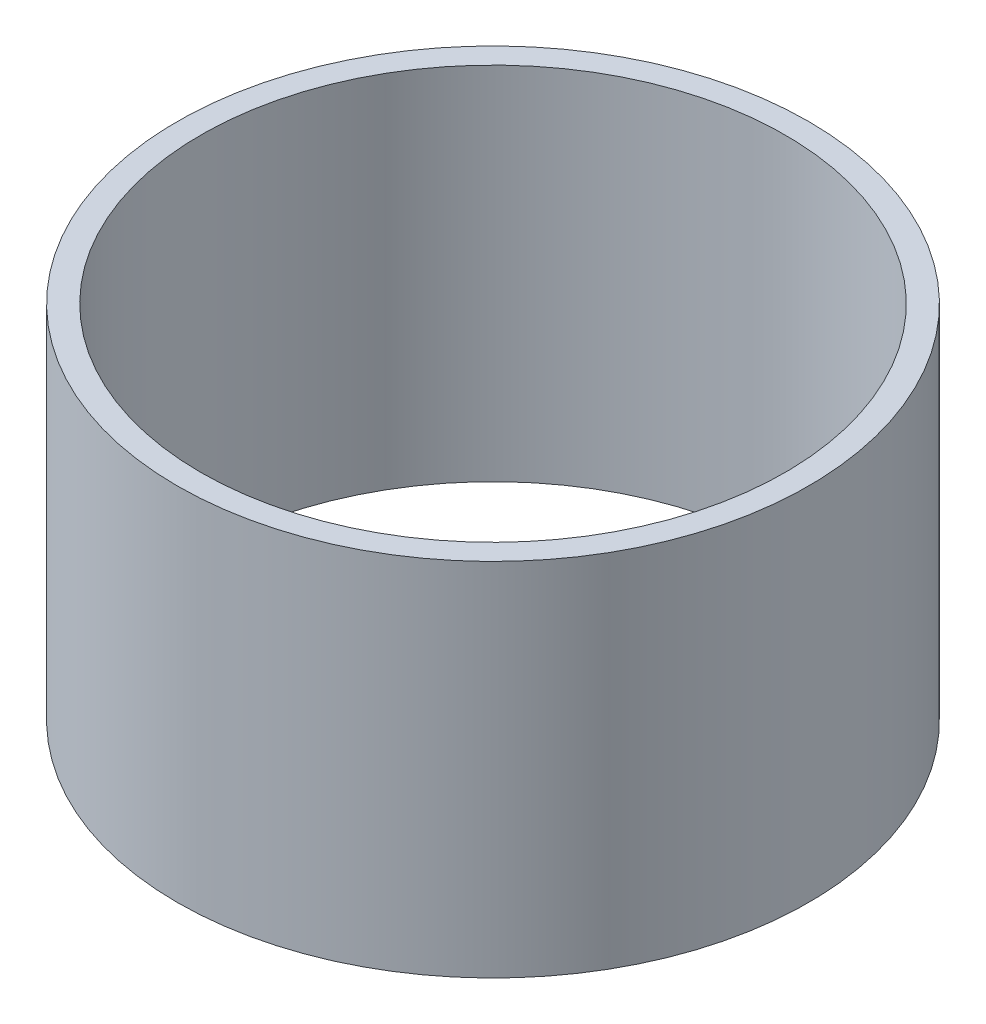
ISO-10303-21;
HEADER;
FILE_DESCRIPTION(('STEP AP214'),'2;1');
FILE_NAME('part.step','',(''),(''),'','','');
FILE_SCHEMA(('AUTOMOTIVE_DESIGN { 1 0 10303 214 1 1 1 1 }'));
ENDSEC;
DATA;
#1=APPLICATION_CONTEXT('core data for automotive mechanical design processes');
#2=APPLICATION_PROTOCOL_DEFINITION('international standard','automotive_design',2000,#1);
#3=PRODUCT_CONTEXT('',#1,'mechanical');
#4=PRODUCT('Part','Part','',(#3));
#5=PRODUCT_RELATED_PRODUCT_CATEGORY('part','',(#4));
#6=PRODUCT_DEFINITION_FORMATION('','',#4);
#7=PRODUCT_DEFINITION_CONTEXT('part definition',#1,'design');
#8=PRODUCT_DEFINITION('design','',#6,#7);
#9=PRODUCT_DEFINITION_SHAPE('','',#8);
#10=(LENGTH_UNIT() NAMED_UNIT(*) SI_UNIT(.MILLI.,.METRE.));
#11=(NAMED_UNIT(*) PLANE_ANGLE_UNIT() SI_UNIT($,.RADIAN.));
#12=(NAMED_UNIT(*) SI_UNIT($,.STERADIAN.) SOLID_ANGLE_UNIT());
#13=UNCERTAINTY_MEASURE_WITH_UNIT(LENGTH_MEASURE(1.E-05),#10,'distance_accuracy_value','');
#14=(GEOMETRIC_REPRESENTATION_CONTEXT(3) GLOBAL_UNCERTAINTY_ASSIGNED_CONTEXT((#13)) GLOBAL_UNIT_ASSIGNED_CONTEXT((#10,
#11,#12)) REPRESENTATION_CONTEXT('',''));
#15=CARTESIAN_POINT('',(0.,0.,0.));
#16=DIRECTION('',(0.,0.,1.));
#17=DIRECTION('',(1.,0.,0.));
#18=AXIS2_PLACEMENT_3D('',#15,#16,#17);
#19=CARTESIAN_POINT('',(-23.114,170.9,-23.114));
#20=DIRECTION('',(0.,1.,0.));
#21=DIRECTION('',(0.,0.,1.));
#22=AXIS2_PLACEMENT_3D('',#19,#20,#21);
#23=PLANE('',#22);
#24=CARTESIAN_POINT('',(0.,170.899999999999,0.));
#25=DIRECTION('',(0.,1.,0.));
#26=DIRECTION('',(0.,0.,1.));
#27=AXIS2_PLACEMENT_3D('',#24,#25,#26);
#28=CIRCLE('',#27,20.575);
#29=CARTESIAN_POINT('',(0.,170.899999999999,20.575));
#30=VERTEX_POINT('',#29);
#31=EDGE_CURVE('E27',#30,#30,#28,.T.);
#32=ORIENTED_EDGE('',*,*,#31,.F.);
#33=EDGE_LOOP('',(#32));
#34=FACE_BOUND('',#33,.T.);
#35=CARTESIAN_POINT('',(0.,170.899999999999,0.));
#36=DIRECTION('',(0.,1.,0.));
#37=DIRECTION('',(0.,0.,1.));
#38=AXIS2_PLACEMENT_3D('',#35,#36,#37);
#39=CIRCLE('',#38,22.225);
#40=CARTESIAN_POINT('',(0.,170.899999999999,22.225));
#41=VERTEX_POINT('',#40);
#42=EDGE_CURVE('E18',#41,#41,#39,.T.);
#43=ORIENTED_EDGE('',*,*,#42,.T.);
#44=EDGE_LOOP('',(#43));
#45=FACE_BOUND('',#44,.T.);
#46=ADVANCED_FACE('F14',(#34,#45),#23,.T.);
#47=CARTESIAN_POINT('',(0.,145.5,0.));
#48=DIRECTION('',(0.,1.,0.));
#49=DIRECTION('',(0.,0.,1.));
#50=AXIS2_PLACEMENT_3D('',#47,#48,#49);
#51=CYLINDRICAL_SURFACE('',#50,22.225);
#52=ORIENTED_EDGE('',*,*,#42,.F.);
#53=EDGE_LOOP('',(#52));
#54=FACE_BOUND('',#53,.T.);
#55=CARTESIAN_POINT('',(0.,145.5,0.));
#56=DIRECTION('',(0.,1.,0.));
#57=DIRECTION('',(0.,0.,1.));
#58=AXIS2_PLACEMENT_3D('',#55,#56,#57);
#59=CIRCLE('',#58,22.225);
#60=CARTESIAN_POINT('',(0.,145.5,22.225));
#61=VERTEX_POINT('',#60);
#62=EDGE_CURVE('E22',#61,#61,#59,.T.);
#63=ORIENTED_EDGE('',*,*,#62,.T.);
#64=EDGE_LOOP('',(#63));
#65=FACE_BOUND('',#64,.T.);
#66=ADVANCED_FACE('F36',(#54,#65),#51,.T.);
#67=CARTESIAN_POINT('',(0.,145.5,0.));
#68=DIRECTION('',(0.,1.,0.));
#69=DIRECTION('',(0.,0.,1.));
#70=AXIS2_PLACEMENT_3D('',#67,#68,#69);
#71=CYLINDRICAL_SURFACE('',#70,20.575);
#72=ORIENTED_EDGE('',*,*,#31,.T.);
#73=EDGE_LOOP('',(#72));
#74=FACE_BOUND('',#73,.T.);
#75=CARTESIAN_POINT('',(0.,145.5,0.));
#76=DIRECTION('',(0.,1.,0.));
#77=DIRECTION('',(0.,0.,1.));
#78=AXIS2_PLACEMENT_3D('',#75,#76,#77);
#79=CIRCLE('',#78,20.575);
#80=CARTESIAN_POINT('',(0.,145.5,20.575));
#81=VERTEX_POINT('',#80);
#82=EDGE_CURVE('E10',#81,#81,#79,.F.);
#83=ORIENTED_EDGE('',*,*,#82,.T.);
#84=EDGE_LOOP('',(#83));
#85=FACE_BOUND('',#84,.T.);
#86=ADVANCED_FACE('F39',(#74,#85),#71,.F.);
#87=CARTESIAN_POINT('',(-23.114,145.5,-23.114));
#88=DIRECTION('',(0.,1.,0.));
#89=DIRECTION('',(0.,0.,1.));
#90=AXIS2_PLACEMENT_3D('',#87,#88,#89);
#91=PLANE('',#90);
#92=ORIENTED_EDGE('',*,*,#82,.F.);
#93=EDGE_LOOP('',(#92));
#94=FACE_BOUND('',#93,.T.);
#95=ORIENTED_EDGE('',*,*,#62,.F.);
#96=EDGE_LOOP('',(#95));
#97=FACE_BOUND('',#96,.T.);
#98=ADVANCED_FACE('F16',(#94,#97),#91,.F.);
#99=CLOSED_SHELL('',(#46,#66,#86,#98));
#100=MANIFOLD_SOLID_BREP('B1',#99);
#101=ADVANCED_BREP_SHAPE_REPRESENTATION('',(#18,#100),#14);
#102=SHAPE_DEFINITION_REPRESENTATION(#9,#101);
ENDSEC;
END-ISO-10303-21;
